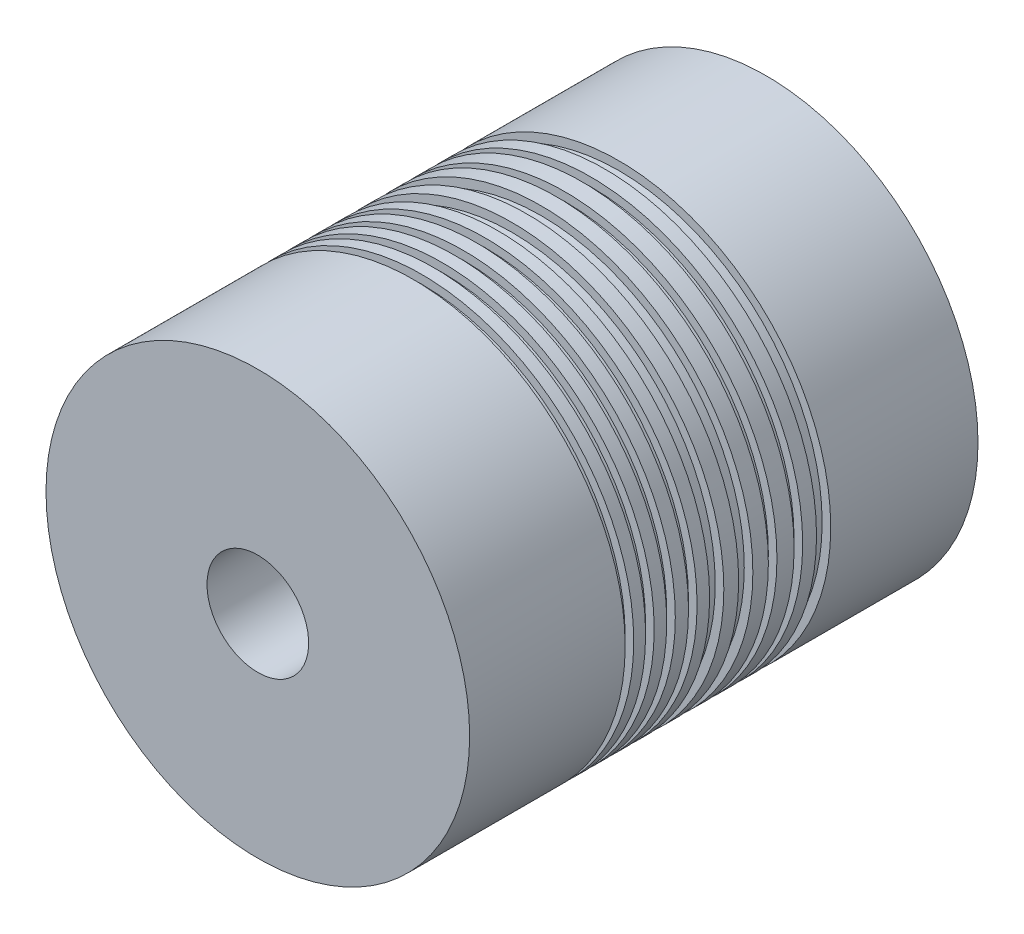
ISO-10303-21;
HEADER;
FILE_DESCRIPTION(('STEP AP214'),'2;1');
FILE_NAME('part.step','',(''),(''),'','','');
FILE_SCHEMA(('AUTOMOTIVE_DESIGN { 1 0 10303 214 1 1 1 1 }'));
ENDSEC;
DATA;
#1=APPLICATION_CONTEXT('core data for automotive mechanical design processes');
#2=APPLICATION_PROTOCOL_DEFINITION('international standard','automotive_design',2000,#1);
#3=PRODUCT_CONTEXT('',#1,'mechanical');
#4=PRODUCT('Part','Part','',(#3));
#5=PRODUCT_RELATED_PRODUCT_CATEGORY('part','',(#4));
#6=PRODUCT_DEFINITION_FORMATION('','',#4);
#7=PRODUCT_DEFINITION_CONTEXT('part definition',#1,'design');
#8=PRODUCT_DEFINITION('design','',#6,#7);
#9=PRODUCT_DEFINITION_SHAPE('','',#8);
#10=(LENGTH_UNIT() NAMED_UNIT(*) SI_UNIT(.MILLI.,.METRE.));
#11=(NAMED_UNIT(*) PLANE_ANGLE_UNIT() SI_UNIT($,.RADIAN.));
#12=(NAMED_UNIT(*) SI_UNIT($,.STERADIAN.) SOLID_ANGLE_UNIT());
#13=UNCERTAINTY_MEASURE_WITH_UNIT(LENGTH_MEASURE(1.E-05),#10,'distance_accuracy_value','');
#14=(GEOMETRIC_REPRESENTATION_CONTEXT(3) GLOBAL_UNCERTAINTY_ASSIGNED_CONTEXT((#13)) GLOBAL_UNIT_ASSIGNED_CONTEXT((#10,
#11,#12)) REPRESENTATION_CONTEXT('',''));
#15=CARTESIAN_POINT('',(0.,0.,0.));
#16=DIRECTION('',(0.,0.,1.));
#17=DIRECTION('',(1.,0.,0.));
#18=AXIS2_PLACEMENT_3D('',#15,#16,#17);
#19=CARTESIAN_POINT('',(0.,0.,0.));
#20=DIRECTION('',(0.,0.,1.));
#21=DIRECTION('',(1.,0.,0.));
#22=AXIS2_PLACEMENT_3D('',#19,#20,#21);
#23=CYLINDRICAL_SURFACE('',#22,12.5);
#24=CARTESIAN_POINT('',(0.,0.,14.12373645067));
#25=DIRECTION('',(0.,0.,1.));
#26=DIRECTION('',(1.,0.,0.));
#27=AXIS2_PLACEMENT_3D('',#24,#25,#26);
#28=CIRCLE('',#27,12.5);
#29=CARTESIAN_POINT('',(12.5,0.,14.12373645067));
#30=VERTEX_POINT('',#29);
#31=EDGE_CURVE('E142',#30,#30,#28,.F.);
#32=ORIENTED_EDGE('',*,*,#31,.F.);
#33=EDGE_LOOP('',(#32));
#34=FACE_BOUND('',#33,.T.);
#35=CARTESIAN_POINT('',(0.,0.,15.));
#36=DIRECTION('',(0.,0.,1.));
#37=DIRECTION('',(1.,0.,0.));
#38=AXIS2_PLACEMENT_3D('',#35,#36,#37);
#39=CIRCLE('',#38,12.5);
#40=CARTESIAN_POINT('',(12.5,0.,15.));
#41=VERTEX_POINT('',#40);
#42=EDGE_CURVE('E18',#41,#41,#39,.F.);
#43=ORIENTED_EDGE('',*,*,#42,.T.);
#44=EDGE_LOOP('',(#43));
#45=FACE_BOUND('',#44,.T.);
#46=ADVANCED_FACE('F15',(#34,#45),#23,.T.);
#47=CARTESIAN_POINT('',(0.,0.,15.));
#48=DIRECTION('',(0.,0.,-1.));
#49=DIRECTION('',(-1.,0.,0.));
#50=AXIS2_PLACEMENT_3D('',#47,#48,#49);
#51=PLANE('',#50);
#52=CARTESIAN_POINT('',(0.,0.,15.));
#53=DIRECTION('',(0.,0.,-1.));
#54=DIRECTION('',(-1.,0.,0.));
#55=AXIS2_PLACEMENT_3D('',#52,#53,#54);
#56=CIRCLE('',#55,11.99371439372);
#57=CARTESIAN_POINT('',(-11.99371439372,0.,15.));
#58=VERTEX_POINT('',#57);
#59=EDGE_CURVE('E140',#58,#58,#56,.F.);
#60=ORIENTED_EDGE('',*,*,#59,.F.);
#61=EDGE_LOOP('',(#60));
#62=FACE_BOUND('',#61,.T.);
#63=ORIENTED_EDGE('',*,*,#42,.F.);
#64=EDGE_LOOP('',(#63));
#65=FACE_BOUND('',#64,.T.);
#66=ADVANCED_FACE('F150',(#62,#65),#51,.F.);
#67=CARTESIAN_POINT('',(0.,0.,14.12373645067));
#68=DIRECTION('',(0.,0.,-1.));
#69=DIRECTION('',(-1.,0.,0.));
#70=AXIS2_PLACEMENT_3D('',#67,#68,#69);
#71=PLANE('',#70);
#72=CARTESIAN_POINT('',(0.,0.,14.12373645067));
#73=DIRECTION('',(0.,0.,-1.));
#74=DIRECTION('',(-1.,0.,0.));
#75=AXIS2_PLACEMENT_3D('',#72,#73,#74);
#76=CIRCLE('',#75,11.99371439372);
#77=CARTESIAN_POINT('',(-11.99371439372,0.,14.12373645067));
#78=VERTEX_POINT('',#77);
#79=EDGE_CURVE('E137',#78,#78,#76,.T.);
#80=ORIENTED_EDGE('',*,*,#79,.F.);
#81=EDGE_LOOP('',(#80));
#82=FACE_BOUND('',#81,.T.);
#83=ORIENTED_EDGE('',*,*,#31,.T.);
#84=EDGE_LOOP('',(#83));
#85=FACE_BOUND('',#84,.T.);
#86=ADVANCED_FACE('F152',(#82,#85),#71,.T.);
#87=CARTESIAN_POINT('',(0.,0.,21.42885357357));
#88=DIRECTION('',(0.,0.,-1.));
#89=DIRECTION('',(-1.,0.,0.));
#90=AXIS2_PLACEMENT_3D('',#87,#88,#89);
#91=CYLINDRICAL_SURFACE('',#90,11.99371439372);
#92=ORIENTED_EDGE('',*,*,#59,.T.);
#93=EDGE_LOOP('',(#92));
#94=FACE_BOUND('',#93,.T.);
#95=CARTESIAN_POINT('',(0.,0.,15.83731850269));
#96=DIRECTION('',(0.,0.,-1.));
#97=DIRECTION('',(-1.,0.,0.));
#98=AXIS2_PLACEMENT_3D('',#95,#96,#97);
#99=CIRCLE('',#98,11.99371439372);
#100=CARTESIAN_POINT('',(-11.99371439372,0.,15.83731850269));
#101=VERTEX_POINT('',#100);
#102=EDGE_CURVE('E134',#101,#101,#99,.F.);
#103=ORIENTED_EDGE('',*,*,#102,.F.);
#104=EDGE_LOOP('',(#103));
#105=FACE_BOUND('',#104,.T.);
#106=ADVANCED_FACE('F159',(#94,#105),#91,.T.);
#107=CARTESIAN_POINT('',(0.,0.,21.42885357357));
#108=DIRECTION('',(0.,0.,-1.));
#109=DIRECTION('',(-1.,0.,0.));
#110=AXIS2_PLACEMENT_3D('',#107,#108,#109);
#111=CYLINDRICAL_SURFACE('',#110,11.99371439372);
#112=CARTESIAN_POINT('',(0.,0.,13.28641794798));
#113=DIRECTION('',(0.,0.,-1.));
#114=DIRECTION('',(-1.,0.,0.));
#115=AXIS2_PLACEMENT_3D('',#112,#113,#114);
#116=CIRCLE('',#115,11.99371439372);
#117=CARTESIAN_POINT('',(-11.99371439372,0.,13.28641794798));
#118=VERTEX_POINT('',#117);
#119=EDGE_CURVE('E131',#118,#118,#116,.F.);
#120=ORIENTED_EDGE('',*,*,#119,.T.);
#121=EDGE_LOOP('',(#120));
#122=FACE_BOUND('',#121,.T.);
#123=ORIENTED_EDGE('',*,*,#79,.T.);
#124=EDGE_LOOP('',(#123));
#125=FACE_BOUND('',#124,.T.);
#126=ADVANCED_FACE('F314',(#122,#125),#111,.T.);
#127=CARTESIAN_POINT('',(0.,0.,15.83731850269));
#128=DIRECTION('',(0.,0.,-1.));
#129=DIRECTION('',(-1.,0.,0.));
#130=AXIS2_PLACEMENT_3D('',#127,#128,#129);
#131=PLANE('',#130);
#132=ORIENTED_EDGE('',*,*,#102,.T.);
#133=EDGE_LOOP('',(#132));
#134=FACE_BOUND('',#133,.T.);
#135=CARTESIAN_POINT('',(0.,0.,15.83731850269));
#136=DIRECTION('',(0.,0.,1.));
#137=DIRECTION('',(1.,0.,0.));
#138=AXIS2_PLACEMENT_3D('',#135,#136,#137);
#139=CIRCLE('',#138,12.5);
#140=CARTESIAN_POINT('',(12.5,0.,15.83731850269));
#141=VERTEX_POINT('',#140);
#142=EDGE_CURVE('E128',#141,#141,#139,.T.);
#143=ORIENTED_EDGE('',*,*,#142,.F.);
#144=EDGE_LOOP('',(#143));
#145=FACE_BOUND('',#144,.T.);
#146=ADVANCED_FACE('F310',(#134,#145),#131,.T.);
#147=CARTESIAN_POINT('',(0.,0.,13.28641794798));
#148=DIRECTION('',(0.,0.,-1.));
#149=DIRECTION('',(-1.,0.,0.));
#150=AXIS2_PLACEMENT_3D('',#147,#148,#149);
#151=PLANE('',#150);
#152=ORIENTED_EDGE('',*,*,#119,.F.);
#153=EDGE_LOOP('',(#152));
#154=FACE_BOUND('',#153,.T.);
#155=CARTESIAN_POINT('',(0.,0.,13.28641794798));
#156=DIRECTION('',(0.,0.,1.));
#157=DIRECTION('',(1.,0.,0.));
#158=AXIS2_PLACEMENT_3D('',#155,#156,#157);
#159=CIRCLE('',#158,12.5);
#160=CARTESIAN_POINT('',(12.5,0.,13.28641794798));
#161=VERTEX_POINT('',#160);
#162=EDGE_CURVE('E125',#161,#161,#159,.F.);
#163=ORIENTED_EDGE('',*,*,#162,.F.);
#164=EDGE_LOOP('',(#163));
#165=FACE_BOUND('',#164,.T.);
#166=ADVANCED_FACE('F306',(#154,#165),#151,.F.);
#167=CARTESIAN_POINT('',(0.,0.,0.));
#168=DIRECTION('',(0.,0.,1.));
#169=DIRECTION('',(1.,0.,0.));
#170=AXIS2_PLACEMENT_3D('',#167,#168,#169);
#171=CYLINDRICAL_SURFACE('',#170,12.5);
#172=ORIENTED_EDGE('',*,*,#142,.T.);
#173=EDGE_LOOP('',(#172));
#174=FACE_BOUND('',#173,.T.);
#175=CARTESIAN_POINT('',(0.,0.,16.57727438879));
#176=DIRECTION('',(0.,0.,1.));
#177=DIRECTION('',(1.,0.,0.));
#178=AXIS2_PLACEMENT_3D('',#175,#176,#177);
#179=CIRCLE('',#178,12.5);
#180=CARTESIAN_POINT('',(12.5,0.,16.57727438879));
#181=VERTEX_POINT('',#180);
#182=EDGE_CURVE('E122',#181,#181,#179,.F.);
#183=ORIENTED_EDGE('',*,*,#182,.T.);
#184=EDGE_LOOP('',(#183));
#185=FACE_BOUND('',#184,.T.);
#186=ADVANCED_FACE('F302',(#174,#185),#171,.T.);
#187=CARTESIAN_POINT('',(0.,0.,0.));
#188=DIRECTION('',(0.,0.,1.));
#189=DIRECTION('',(1.,0.,0.));
#190=AXIS2_PLACEMENT_3D('',#187,#188,#189);
#191=CYLINDRICAL_SURFACE('',#190,12.5);
#192=CARTESIAN_POINT('',(0.,0.,12.37120935202));
#193=DIRECTION('',(0.,0.,1.));
#194=DIRECTION('',(1.,0.,0.));
#195=AXIS2_PLACEMENT_3D('',#192,#193,#194);
#196=CIRCLE('',#195,12.5);
#197=CARTESIAN_POINT('',(12.5,0.,12.37120935202));
#198=VERTEX_POINT('',#197);
#199=EDGE_CURVE('E119',#198,#198,#196,.F.);
#200=ORIENTED_EDGE('',*,*,#199,.F.);
#201=EDGE_LOOP('',(#200));
#202=FACE_BOUND('',#201,.T.);
#203=ORIENTED_EDGE('',*,*,#162,.T.);
#204=EDGE_LOOP('',(#203));
#205=FACE_BOUND('',#204,.T.);
#206=ADVANCED_FACE('F298',(#202,#205),#191,.T.);
#207=CARTESIAN_POINT('',(0.,0.,16.57727438879));
#208=DIRECTION('',(0.,0.,-1.));
#209=DIRECTION('',(-1.,0.,0.));
#210=AXIS2_PLACEMENT_3D('',#207,#208,#209);
#211=PLANE('',#210);
#212=CARTESIAN_POINT('',(0.,0.,16.57727438879));
#213=DIRECTION('',(0.,0.,-1.));
#214=DIRECTION('',(-1.,0.,0.));
#215=AXIS2_PLACEMENT_3D('',#212,#213,#214);
#216=CIRCLE('',#215,11.99371439372);
#217=CARTESIAN_POINT('',(-11.99371439372,0.,16.57727438879));
#218=VERTEX_POINT('',#217);
#219=EDGE_CURVE('E116',#218,#218,#216,.F.);
#220=ORIENTED_EDGE('',*,*,#219,.F.);
#221=EDGE_LOOP('',(#220));
#222=FACE_BOUND('',#221,.T.);
#223=ORIENTED_EDGE('',*,*,#182,.F.);
#224=EDGE_LOOP('',(#223));
#225=FACE_BOUND('',#224,.T.);
#226=ADVANCED_FACE('F294',(#222,#225),#211,.F.);
#227=CARTESIAN_POINT('',(0.,0.,12.37120935202));
#228=DIRECTION('',(0.,0.,-1.));
#229=DIRECTION('',(-1.,0.,0.));
#230=AXIS2_PLACEMENT_3D('',#227,#228,#229);
#231=PLANE('',#230);
#232=CARTESIAN_POINT('',(0.,0.,12.37120935202));
#233=DIRECTION('',(0.,0.,-1.));
#234=DIRECTION('',(-1.,0.,0.));
#235=AXIS2_PLACEMENT_3D('',#232,#233,#234);
#236=CIRCLE('',#235,11.99371439372);
#237=CARTESIAN_POINT('',(-11.99371439372,0.,12.37120935202));
#238=VERTEX_POINT('',#237);
#239=EDGE_CURVE('E113',#238,#238,#236,.T.);
#240=ORIENTED_EDGE('',*,*,#239,.F.);
#241=EDGE_LOOP('',(#240));
#242=FACE_BOUND('',#241,.T.);
#243=ORIENTED_EDGE('',*,*,#199,.T.);
#244=EDGE_LOOP('',(#243));
#245=FACE_BOUND('',#244,.T.);
#246=ADVANCED_FACE('F290',(#242,#245),#231,.T.);
#247=CARTESIAN_POINT('',(0.,0.,21.42885357357));
#248=DIRECTION('',(0.,0.,-1.));
#249=DIRECTION('',(-1.,0.,0.));
#250=AXIS2_PLACEMENT_3D('',#247,#248,#249);
#251=CYLINDRICAL_SURFACE('',#250,11.99371439372);
#252=ORIENTED_EDGE('',*,*,#219,.T.);
#253=EDGE_LOOP('',(#252));
#254=FACE_BOUND('',#253,.T.);
#255=CARTESIAN_POINT('',(0.,0.,17.08355999507));
#256=DIRECTION('',(0.,0.,-1.));
#257=DIRECTION('',(-1.,0.,0.));
#258=AXIS2_PLACEMENT_3D('',#255,#256,#257);
#259=CIRCLE('',#258,11.99371439372);
#260=CARTESIAN_POINT('',(-11.99371439372,0.,17.08355999507));
#261=VERTEX_POINT('',#260);
#262=EDGE_CURVE('E110',#261,#261,#259,.F.);
#263=ORIENTED_EDGE('',*,*,#262,.F.);
#264=EDGE_LOOP('',(#263));
#265=FACE_BOUND('',#264,.T.);
#266=ADVANCED_FACE('F286',(#254,#265),#251,.T.);
#267=CARTESIAN_POINT('',(0.,0.,21.42885357357));
#268=DIRECTION('',(0.,0.,-1.));
#269=DIRECTION('',(-1.,0.,0.));
#270=AXIS2_PLACEMENT_3D('',#267,#268,#269);
#271=CYLINDRICAL_SURFACE('',#270,11.99371439372);
#272=CARTESIAN_POINT('',(0.,0.,11.86492374574));
#273=DIRECTION('',(0.,0.,-1.));
#274=DIRECTION('',(-1.,0.,0.));
#275=AXIS2_PLACEMENT_3D('',#272,#273,#274);
#276=CIRCLE('',#275,11.99371439372);
#277=CARTESIAN_POINT('',(-11.99371439372,0.,11.86492374574));
#278=VERTEX_POINT('',#277);
#279=EDGE_CURVE('E107',#278,#278,#276,.F.);
#280=ORIENTED_EDGE('',*,*,#279,.T.);
#281=EDGE_LOOP('',(#280));
#282=FACE_BOUND('',#281,.T.);
#283=ORIENTED_EDGE('',*,*,#239,.T.);
#284=EDGE_LOOP('',(#283));
#285=FACE_BOUND('',#284,.T.);
#286=ADVANCED_FACE('F282',(#282,#285),#271,.T.);
#287=CARTESIAN_POINT('',(0.,0.,17.08355999507));
#288=DIRECTION('',(0.,0.,-1.));
#289=DIRECTION('',(-1.,0.,0.));
#290=AXIS2_PLACEMENT_3D('',#287,#288,#289);
#291=PLANE('',#290);
#292=ORIENTED_EDGE('',*,*,#262,.T.);
#293=EDGE_LOOP('',(#292));
#294=FACE_BOUND('',#293,.T.);
#295=CARTESIAN_POINT('',(0.,0.,17.08355999507));
#296=DIRECTION('',(0.,0.,1.));
#297=DIRECTION('',(1.,0.,0.));
#298=AXIS2_PLACEMENT_3D('',#295,#296,#297);
#299=CIRCLE('',#298,12.5);
#300=CARTESIAN_POINT('',(12.5,0.,17.08355999507));
#301=VERTEX_POINT('',#300);
#302=EDGE_CURVE('E104',#301,#301,#299,.T.);
#303=ORIENTED_EDGE('',*,*,#302,.F.);
#304=EDGE_LOOP('',(#303));
#305=FACE_BOUND('',#304,.T.);
#306=ADVANCED_FACE('F278',(#294,#305),#291,.T.);
#307=CARTESIAN_POINT('',(0.,0.,11.86492374574));
#308=DIRECTION('',(0.,0.,-1.));
#309=DIRECTION('',(-1.,0.,0.));
#310=AXIS2_PLACEMENT_3D('',#307,#308,#309);
#311=PLANE('',#310);
#312=ORIENTED_EDGE('',*,*,#279,.F.);
#313=EDGE_LOOP('',(#312));
#314=FACE_BOUND('',#313,.T.);
#315=CARTESIAN_POINT('',(0.,0.,11.86492374574));
#316=DIRECTION('',(0.,0.,1.));
#317=DIRECTION('',(1.,0.,0.));
#318=AXIS2_PLACEMENT_3D('',#315,#316,#317);
#319=CIRCLE('',#318,12.5);
#320=CARTESIAN_POINT('',(12.5,0.,11.86492374574));
#321=VERTEX_POINT('',#320);
#322=EDGE_CURVE('E101',#321,#321,#319,.F.);
#323=ORIENTED_EDGE('',*,*,#322,.F.);
#324=EDGE_LOOP('',(#323));
#325=FACE_BOUND('',#324,.T.);
#326=ADVANCED_FACE('F274',(#314,#325),#311,.F.);
#327=CARTESIAN_POINT('',(0.,0.,0.));
#328=DIRECTION('',(0.,0.,1.));
#329=DIRECTION('',(1.,0.,0.));
#330=AXIS2_PLACEMENT_3D('',#327,#328,#329);
#331=CYLINDRICAL_SURFACE('',#330,12.5);
#332=ORIENTED_EDGE('',*,*,#302,.T.);
#333=EDGE_LOOP('',(#332));
#334=FACE_BOUND('',#333,.T.);
#335=CARTESIAN_POINT('',(0.,0.,17.8624609278));
#336=DIRECTION('',(0.,0.,1.));
#337=DIRECTION('',(1.,0.,0.));
#338=AXIS2_PLACEMENT_3D('',#335,#336,#337);
#339=CIRCLE('',#338,12.5);
#340=CARTESIAN_POINT('',(12.5,0.,17.8624609278));
#341=VERTEX_POINT('',#340);
#342=EDGE_CURVE('E98',#341,#341,#339,.F.);
#343=ORIENTED_EDGE('',*,*,#342,.T.);
#344=EDGE_LOOP('',(#343));
#345=FACE_BOUND('',#344,.T.);
#346=ADVANCED_FACE('F270',(#334,#345),#331,.T.);
#347=CARTESIAN_POINT('',(0.,0.,0.));
#348=DIRECTION('',(0.,0.,1.));
#349=DIRECTION('',(1.,0.,0.));
#350=AXIS2_PLACEMENT_3D('',#347,#348,#349);
#351=CYLINDRICAL_SURFACE('',#350,12.5);
#352=CARTESIAN_POINT('',(0.,0.,10.85235253318));
#353=DIRECTION('',(0.,0.,1.));
#354=DIRECTION('',(1.,0.,0.));
#355=AXIS2_PLACEMENT_3D('',#352,#353,#354);
#356=CIRCLE('',#355,12.5);
#357=CARTESIAN_POINT('',(12.5,0.,10.85235253318));
#358=VERTEX_POINT('',#357);
#359=EDGE_CURVE('E95',#358,#358,#356,.F.);
#360=ORIENTED_EDGE('',*,*,#359,.F.);
#361=EDGE_LOOP('',(#360));
#362=FACE_BOUND('',#361,.T.);
#363=ORIENTED_EDGE('',*,*,#322,.T.);
#364=EDGE_LOOP('',(#363));
#365=FACE_BOUND('',#364,.T.);
#366=ADVANCED_FACE('F266',(#362,#365),#351,.T.);
#367=CARTESIAN_POINT('',(0.,0.,17.8624609278));
#368=DIRECTION('',(0.,0.,-1.));
#369=DIRECTION('',(-1.,0.,0.));
#370=AXIS2_PLACEMENT_3D('',#367,#368,#369);
#371=PLANE('',#370);
#372=CARTESIAN_POINT('',(0.,0.,17.8624609278));
#373=DIRECTION('',(0.,0.,-1.));
#374=DIRECTION('',(-1.,0.,0.));
#375=AXIS2_PLACEMENT_3D('',#372,#373,#374);
#376=CIRCLE('',#375,11.99371439372);
#377=CARTESIAN_POINT('',(-11.99371439372,0.,17.8624609278));
#378=VERTEX_POINT('',#377);
#379=EDGE_CURVE('E92',#378,#378,#376,.F.);
#380=ORIENTED_EDGE('',*,*,#379,.F.);
#381=EDGE_LOOP('',(#380));
#382=FACE_BOUND('',#381,.T.);
#383=ORIENTED_EDGE('',*,*,#342,.F.);
#384=EDGE_LOOP('',(#383));
#385=FACE_BOUND('',#384,.T.);
#386=ADVANCED_FACE('F262',(#382,#385),#371,.F.);
#387=CARTESIAN_POINT('',(0.,0.,10.85235253318));
#388=DIRECTION('',(0.,0.,-1.));
#389=DIRECTION('',(-1.,0.,0.));
#390=AXIS2_PLACEMENT_3D('',#387,#388,#389);
#391=PLANE('',#390);
#392=CARTESIAN_POINT('',(0.,0.,10.85235253318));
#393=DIRECTION('',(0.,0.,-1.));
#394=DIRECTION('',(-1.,0.,0.));
#395=AXIS2_PLACEMENT_3D('',#392,#393,#394);
#396=CIRCLE('',#395,11.99371439372);
#397=CARTESIAN_POINT('',(-11.99371439372,0.,10.85235253318));
#398=VERTEX_POINT('',#397);
#399=EDGE_CURVE('E89',#398,#398,#396,.T.);
#400=ORIENTED_EDGE('',*,*,#399,.F.);
#401=EDGE_LOOP('',(#400));
#402=FACE_BOUND('',#401,.T.);
#403=ORIENTED_EDGE('',*,*,#359,.T.);
#404=EDGE_LOOP('',(#403));
#405=FACE_BOUND('',#404,.T.);
#406=ADVANCED_FACE('F258',(#402,#405),#391,.T.);
#407=CARTESIAN_POINT('',(0.,0.,21.42885357357));
#408=DIRECTION('',(0.,0.,-1.));
#409=DIRECTION('',(-1.,0.,0.));
#410=AXIS2_PLACEMENT_3D('',#407,#408,#409);
#411=CYLINDRICAL_SURFACE('',#410,11.99371439372);
#412=ORIENTED_EDGE('',*,*,#379,.T.);
#413=EDGE_LOOP('',(#412));
#414=FACE_BOUND('',#413,.T.);
#415=CARTESIAN_POINT('',(0.,0.,18.36874653408));
#416=DIRECTION('',(0.,0.,-1.));
#417=DIRECTION('',(-1.,0.,0.));
#418=AXIS2_PLACEMENT_3D('',#415,#416,#417);
#419=CIRCLE('',#418,11.99371439372);
#420=CARTESIAN_POINT('',(-11.99371439372,0.,18.36874653408));
#421=VERTEX_POINT('',#420);
#422=EDGE_CURVE('E86',#421,#421,#419,.F.);
#423=ORIENTED_EDGE('',*,*,#422,.F.);
#424=EDGE_LOOP('',(#423));
#425=FACE_BOUND('',#424,.T.);
#426=ADVANCED_FACE('F254',(#414,#425),#411,.T.);
#427=CARTESIAN_POINT('',(0.,0.,21.42885357357));
#428=DIRECTION('',(0.,0.,-1.));
#429=DIRECTION('',(-1.,0.,0.));
#430=AXIS2_PLACEMENT_3D('',#427,#428,#429);
#431=CYLINDRICAL_SURFACE('',#430,11.99371439372);
#432=CARTESIAN_POINT('',(0.,0.,10.3460669269));
#433=DIRECTION('',(0.,0.,-1.));
#434=DIRECTION('',(-1.,0.,0.));
#435=AXIS2_PLACEMENT_3D('',#432,#433,#434);
#436=CIRCLE('',#435,11.99371439372);
#437=CARTESIAN_POINT('',(-11.99371439372,0.,10.3460669269));
#438=VERTEX_POINT('',#437);
#439=EDGE_CURVE('E83',#438,#438,#436,.F.);
#440=ORIENTED_EDGE('',*,*,#439,.T.);
#441=EDGE_LOOP('',(#440));
#442=FACE_BOUND('',#441,.T.);
#443=ORIENTED_EDGE('',*,*,#399,.T.);
#444=EDGE_LOOP('',(#443));
#445=FACE_BOUND('',#444,.T.);
#446=ADVANCED_FACE('F250',(#442,#445),#431,.T.);
#447=CARTESIAN_POINT('',(0.,0.,18.36874653408));
#448=DIRECTION('',(0.,0.,-1.));
#449=DIRECTION('',(-1.,0.,0.));
#450=AXIS2_PLACEMENT_3D('',#447,#448,#449);
#451=PLANE('',#450);
#452=ORIENTED_EDGE('',*,*,#422,.T.);
#453=EDGE_LOOP('',(#452));
#454=FACE_BOUND('',#453,.T.);
#455=CARTESIAN_POINT('',(0.,0.,18.36874653408));
#456=DIRECTION('',(0.,0.,1.));
#457=DIRECTION('',(1.,0.,0.));
#458=AXIS2_PLACEMENT_3D('',#455,#456,#457);
#459=CIRCLE('',#458,12.5);
#460=CARTESIAN_POINT('',(12.5,0.,18.36874653408));
#461=VERTEX_POINT('',#460);
#462=EDGE_CURVE('E80',#461,#461,#459,.T.);
#463=ORIENTED_EDGE('',*,*,#462,.F.);
#464=EDGE_LOOP('',(#463));
#465=FACE_BOUND('',#464,.T.);
#466=ADVANCED_FACE('F246',(#454,#465),#451,.T.);
#467=CARTESIAN_POINT('',(0.,0.,10.3460669269));
#468=DIRECTION('',(0.,0.,-1.));
#469=DIRECTION('',(-1.,0.,0.));
#470=AXIS2_PLACEMENT_3D('',#467,#468,#469);
#471=PLANE('',#470);
#472=ORIENTED_EDGE('',*,*,#439,.F.);
#473=EDGE_LOOP('',(#472));
#474=FACE_BOUND('',#473,.T.);
#475=CARTESIAN_POINT('',(0.,0.,10.3460669269));
#476=DIRECTION('',(0.,0.,1.));
#477=DIRECTION('',(1.,0.,0.));
#478=AXIS2_PLACEMENT_3D('',#475,#476,#477);
#479=CIRCLE('',#478,12.5);
#480=CARTESIAN_POINT('',(12.5,0.,10.3460669269));
#481=VERTEX_POINT('',#480);
#482=EDGE_CURVE('E77',#481,#481,#479,.F.);
#483=ORIENTED_EDGE('',*,*,#482,.F.);
#484=EDGE_LOOP('',(#483));
#485=FACE_BOUND('',#484,.T.);
#486=ADVANCED_FACE('F242',(#474,#485),#471,.F.);
#487=CARTESIAN_POINT('',(0.,0.,0.));
#488=DIRECTION('',(0.,0.,1.));
#489=DIRECTION('',(1.,0.,0.));
#490=AXIS2_PLACEMENT_3D('',#487,#488,#489);
#491=CYLINDRICAL_SURFACE('',#490,12.5);
#492=CARTESIAN_POINT('',(0.,0.,19.10870242018));
#493=DIRECTION('',(0.,0.,1.));
#494=DIRECTION('',(1.,0.,0.));
#495=AXIS2_PLACEMENT_3D('',#492,#493,#494);
#496=CIRCLE('',#495,12.5);
#497=CARTESIAN_POINT('',(12.5,0.,19.10870242018));
#498=VERTEX_POINT('',#497);
#499=EDGE_CURVE('E74',#498,#498,#496,.F.);
#500=ORIENTED_EDGE('',*,*,#499,.T.);
#501=EDGE_LOOP('',(#500));
#502=FACE_BOUND('',#501,.T.);
#503=ORIENTED_EDGE('',*,*,#462,.T.);
#504=EDGE_LOOP('',(#503));
#505=FACE_BOUND('',#504,.T.);
#506=ADVANCED_FACE('F238',(#502,#505),#491,.T.);
#507=CARTESIAN_POINT('',(0.,0.,0.));
#508=DIRECTION('',(0.,0.,1.));
#509=DIRECTION('',(1.,0.,0.));
#510=AXIS2_PLACEMENT_3D('',#507,#508,#509);
#511=CYLINDRICAL_SURFACE('',#510,12.5);
#512=CARTESIAN_POINT('',(0.,0.,9.528220947532));
#513=DIRECTION('',(0.,0.,1.));
#514=DIRECTION('',(1.,0.,0.));
#515=AXIS2_PLACEMENT_3D('',#512,#513,#514);
#516=CIRCLE('',#515,12.5);
#517=CARTESIAN_POINT('',(12.5,0.,9.528220947532));
#518=VERTEX_POINT('',#517);
#519=EDGE_CURVE('E71',#518,#518,#516,.F.);
#520=ORIENTED_EDGE('',*,*,#519,.F.);
#521=EDGE_LOOP('',(#520));
#522=FACE_BOUND('',#521,.T.);
#523=ORIENTED_EDGE('',*,*,#482,.T.);
#524=EDGE_LOOP('',(#523));
#525=FACE_BOUND('',#524,.T.);
#526=ADVANCED_FACE('F234',(#522,#525),#511,.T.);
#527=CARTESIAN_POINT('',(0.,0.,19.10870242018));
#528=DIRECTION('',(0.,0.,-1.));
#529=DIRECTION('',(-1.,0.,0.));
#530=AXIS2_PLACEMENT_3D('',#527,#528,#529);
#531=PLANE('',#530);
#532=CARTESIAN_POINT('',(0.,0.,19.10870242018));
#533=DIRECTION('',(0.,0.,-1.));
#534=DIRECTION('',(-1.,0.,0.));
#535=AXIS2_PLACEMENT_3D('',#532,#533,#534);
#536=CIRCLE('',#535,11.99371439372);
#537=CARTESIAN_POINT('',(-11.99371439372,0.,19.10870242018));
#538=VERTEX_POINT('',#537);
#539=EDGE_CURVE('E68',#538,#538,#536,.F.);
#540=ORIENTED_EDGE('',*,*,#539,.F.);
#541=EDGE_LOOP('',(#540));
#542=FACE_BOUND('',#541,.T.);
#543=ORIENTED_EDGE('',*,*,#499,.F.);
#544=EDGE_LOOP('',(#543));
#545=FACE_BOUND('',#544,.T.);
#546=ADVANCED_FACE('F230',(#542,#545),#531,.F.);
#547=CARTESIAN_POINT('',(0.,0.,9.528220947532));
#548=DIRECTION('',(0.,0.,-1.));
#549=DIRECTION('',(-1.,0.,0.));
#550=AXIS2_PLACEMENT_3D('',#547,#548,#549);
#551=PLANE('',#550);
#552=CARTESIAN_POINT('',(0.,0.,9.528220947532));
#553=DIRECTION('',(0.,0.,-1.));
#554=DIRECTION('',(-1.,0.,0.));
#555=AXIS2_PLACEMENT_3D('',#552,#553,#554);
#556=CIRCLE('',#555,11.99371439372);
#557=CARTESIAN_POINT('',(-11.99371439372,0.,9.528220947532));
#558=VERTEX_POINT('',#557);
#559=EDGE_CURVE('E65',#558,#558,#556,.T.);
#560=ORIENTED_EDGE('',*,*,#559,.F.);
#561=EDGE_LOOP('',(#560));
#562=FACE_BOUND('',#561,.T.);
#563=ORIENTED_EDGE('',*,*,#519,.T.);
#564=EDGE_LOOP('',(#563));
#565=FACE_BOUND('',#564,.T.);
#566=ADVANCED_FACE('F226',(#562,#565),#551,.T.);
#567=CARTESIAN_POINT('',(0.,0.,21.42885357357));
#568=DIRECTION('',(0.,0.,-1.));
#569=DIRECTION('',(-1.,0.,0.));
#570=AXIS2_PLACEMENT_3D('',#567,#568,#569);
#571=CYLINDRICAL_SURFACE('',#570,11.99371439372);
#572=ORIENTED_EDGE('',*,*,#539,.T.);
#573=EDGE_LOOP('',(#572));
#574=FACE_BOUND('',#573,.T.);
#575=CARTESIAN_POINT('',(0.,0.,19.61498802646));
#576=DIRECTION('',(0.,0.,-1.));
#577=DIRECTION('',(-1.,0.,0.));
#578=AXIS2_PLACEMENT_3D('',#575,#576,#577);
#579=CIRCLE('',#578,11.99371439372);
#580=CARTESIAN_POINT('',(-11.99371439372,0.,19.61498802646));
#581=VERTEX_POINT('',#580);
#582=EDGE_CURVE('E62',#581,#581,#579,.F.);
#583=ORIENTED_EDGE('',*,*,#582,.F.);
#584=EDGE_LOOP('',(#583));
#585=FACE_BOUND('',#584,.T.);
#586=ADVANCED_FACE('F222',(#574,#585),#571,.T.);
#587=CARTESIAN_POINT('',(0.,0.,21.42885357357));
#588=DIRECTION('',(0.,0.,-1.));
#589=DIRECTION('',(-1.,0.,0.));
#590=AXIS2_PLACEMENT_3D('',#587,#588,#589);
#591=CYLINDRICAL_SURFACE('',#590,11.99371439372);
#592=CARTESIAN_POINT('',(0.,0.,8.690902444841));
#593=DIRECTION('',(0.,0.,-1.));
#594=DIRECTION('',(-1.,0.,0.));
#595=AXIS2_PLACEMENT_3D('',#592,#593,#594);
#596=CIRCLE('',#595,11.99371439372);
#597=CARTESIAN_POINT('',(-11.99371439372,0.,8.690902444841));
#598=VERTEX_POINT('',#597);
#599=EDGE_CURVE('E59',#598,#598,#596,.F.);
#600=ORIENTED_EDGE('',*,*,#599,.T.);
#601=EDGE_LOOP('',(#600));
#602=FACE_BOUND('',#601,.T.);
#603=ORIENTED_EDGE('',*,*,#559,.T.);
#604=EDGE_LOOP('',(#603));
#605=FACE_BOUND('',#604,.T.);
#606=ADVANCED_FACE('F218',(#602,#605),#591,.T.);
#607=CARTESIAN_POINT('',(0.,0.,19.61498802646));
#608=DIRECTION('',(0.,0.,-1.));
#609=DIRECTION('',(-1.,0.,0.));
#610=AXIS2_PLACEMENT_3D('',#607,#608,#609);
#611=PLANE('',#610);
#612=ORIENTED_EDGE('',*,*,#582,.T.);
#613=EDGE_LOOP('',(#612));
#614=FACE_BOUND('',#613,.T.);
#615=CARTESIAN_POINT('',(0.,0.,19.61498802646));
#616=DIRECTION('',(0.,0.,1.));
#617=DIRECTION('',(1.,0.,0.));
#618=AXIS2_PLACEMENT_3D('',#615,#616,#617);
#619=CIRCLE('',#618,12.5);
#620=CARTESIAN_POINT('',(12.5,0.,19.61498802646));
#621=VERTEX_POINT('',#620);
#622=EDGE_CURVE('E56',#621,#621,#619,.T.);
#623=ORIENTED_EDGE('',*,*,#622,.F.);
#624=EDGE_LOOP('',(#623));
#625=FACE_BOUND('',#624,.T.);
#626=ADVANCED_FACE('F214',(#614,#625),#611,.T.);
#627=CARTESIAN_POINT('',(0.,0.,8.690902444841));
#628=DIRECTION('',(0.,0.,-1.));
#629=DIRECTION('',(-1.,0.,0.));
#630=AXIS2_PLACEMENT_3D('',#627,#628,#629);
#631=PLANE('',#630);
#632=ORIENTED_EDGE('',*,*,#599,.F.);
#633=EDGE_LOOP('',(#632));
#634=FACE_BOUND('',#633,.T.);
#635=CARTESIAN_POINT('',(0.,0.,8.690902444841));
#636=DIRECTION('',(0.,0.,1.));
#637=DIRECTION('',(1.,0.,0.));
#638=AXIS2_PLACEMENT_3D('',#635,#636,#637);
#639=CIRCLE('',#638,12.5);
#640=CARTESIAN_POINT('',(12.5,0.,8.690902444841));
#641=VERTEX_POINT('',#640);
#642=EDGE_CURVE('E53',#641,#641,#639,.F.);
#643=ORIENTED_EDGE('',*,*,#642,.F.);
#644=EDGE_LOOP('',(#643));
#645=FACE_BOUND('',#644,.T.);
#646=ADVANCED_FACE('F210',(#634,#645),#631,.F.);
#647=CARTESIAN_POINT('',(0.,0.,0.));
#648=DIRECTION('',(0.,0.,1.));
#649=DIRECTION('',(1.,0.,0.));
#650=AXIS2_PLACEMENT_3D('',#647,#648,#649);
#651=CYLINDRICAL_SURFACE('',#650,12.5);
#652=CARTESIAN_POINT('',(0.,0.,20.31599886592));
#653=DIRECTION('',(0.,0.,1.));
#654=DIRECTION('',(1.,0.,0.));
#655=AXIS2_PLACEMENT_3D('',#652,#653,#654);
#656=CIRCLE('',#655,12.5);
#657=CARTESIAN_POINT('',(12.5,0.,20.31599886592));
#658=VERTEX_POINT('',#657);
#659=EDGE_CURVE('E50',#658,#658,#656,.F.);
#660=ORIENTED_EDGE('',*,*,#659,.T.);
#661=EDGE_LOOP('',(#660));
#662=FACE_BOUND('',#661,.T.);
#663=ORIENTED_EDGE('',*,*,#622,.T.);
#664=EDGE_LOOP('',(#663));
#665=FACE_BOUND('',#664,.T.);
#666=ADVANCED_FACE('F206',(#662,#665),#651,.T.);
#667=CARTESIAN_POINT('',(0.,0.,0.));
#668=DIRECTION('',(0.,0.,1.));
#669=DIRECTION('',(1.,0.,0.));
#670=AXIS2_PLACEMENT_3D('',#667,#668,#669);
#671=CYLINDRICAL_SURFACE('',#670,12.5);
#672=CARTESIAN_POINT('',(0.,0.,0.));
#673=DIRECTION('',(0.,0.,1.));
#674=DIRECTION('',(1.,0.,0.));
#675=AXIS2_PLACEMENT_3D('',#672,#673,#674);
#676=CIRCLE('',#675,12.5);
#677=CARTESIAN_POINT('',(12.5,0.,0.));
#678=VERTEX_POINT('',#677);
#679=EDGE_CURVE('E47',#678,#678,#676,.T.);
#680=ORIENTED_EDGE('',*,*,#679,.T.);
#681=EDGE_LOOP('',(#680));
#682=FACE_BOUND('',#681,.T.);
#683=ORIENTED_EDGE('',*,*,#642,.T.);
#684=EDGE_LOOP('',(#683));
#685=FACE_BOUND('',#684,.T.);
#686=ADVANCED_FACE('F202',(#682,#685),#671,.T.);
#687=CARTESIAN_POINT('',(0.,0.,20.31599886592));
#688=DIRECTION('',(0.,0.,-1.));
#689=DIRECTION('',(-1.,0.,0.));
#690=AXIS2_PLACEMENT_3D('',#687,#688,#689);
#691=PLANE('',#690);
#692=CARTESIAN_POINT('',(0.,0.,20.31599886592));
#693=DIRECTION('',(0.,0.,-1.));
#694=DIRECTION('',(-1.,0.,0.));
#695=AXIS2_PLACEMENT_3D('',#692,#693,#694);
#696=CIRCLE('',#695,11.99371439372);
#697=CARTESIAN_POINT('',(-11.99371439372,0.,20.31599886592));
#698=VERTEX_POINT('',#697);
#699=EDGE_CURVE('E44',#698,#698,#696,.F.);
#700=ORIENTED_EDGE('',*,*,#699,.F.);
#701=EDGE_LOOP('',(#700));
#702=FACE_BOUND('',#701,.T.);
#703=ORIENTED_EDGE('',*,*,#659,.F.);
#704=EDGE_LOOP('',(#703));
#705=FACE_BOUND('',#704,.T.);
#706=ADVANCED_FACE('F198',(#702,#705),#691,.F.);
#707=CARTESIAN_POINT('',(0.,0.,0.));
#708=DIRECTION('',(0.,0.,1.));
#709=DIRECTION('',(1.,0.,0.));
#710=AXIS2_PLACEMENT_3D('',#707,#708,#709);
#711=PLANE('',#710);
#712=CARTESIAN_POINT('',(0.,0.,0.));
#713=DIRECTION('',(0.,0.,1.));
#714=DIRECTION('',(1.,0.,0.));
#715=AXIS2_PLACEMENT_3D('',#712,#713,#714);
#716=CIRCLE('',#715,5.);
#717=CARTESIAN_POINT('',(5.,0.,0.));
#718=VERTEX_POINT('',#717);
#719=EDGE_CURVE('E41',#718,#718,#716,.T.);
#720=ORIENTED_EDGE('',*,*,#719,.T.);
#721=EDGE_LOOP('',(#720));
#722=FACE_BOUND('',#721,.T.);
#723=ORIENTED_EDGE('',*,*,#679,.F.);
#724=EDGE_LOOP('',(#723));
#725=FACE_BOUND('',#724,.T.);
#726=ADVANCED_FACE('F194',(#722,#725),#711,.F.);
#727=CARTESIAN_POINT('',(0.,0.,21.42885357357));
#728=DIRECTION('',(0.,0.,-1.));
#729=DIRECTION('',(-1.,0.,0.));
#730=AXIS2_PLACEMENT_3D('',#727,#728,#729);
#731=CYLINDRICAL_SURFACE('',#730,11.99371439372);
#732=ORIENTED_EDGE('',*,*,#699,.T.);
#733=EDGE_LOOP('',(#732));
#734=FACE_BOUND('',#733,.T.);
#735=CARTESIAN_POINT('',(0.,0.,20.8222844722));
#736=DIRECTION('',(0.,0.,-1.));
#737=DIRECTION('',(-1.,0.,0.));
#738=AXIS2_PLACEMENT_3D('',#735,#736,#737);
#739=CIRCLE('',#738,11.99371439372);
#740=CARTESIAN_POINT('',(-11.99371439372,0.,20.8222844722));
#741=VERTEX_POINT('',#740);
#742=EDGE_CURVE('E38',#741,#741,#739,.F.);
#743=ORIENTED_EDGE('',*,*,#742,.F.);
#744=EDGE_LOOP('',(#743));
#745=FACE_BOUND('',#744,.T.);
#746=ADVANCED_FACE('F190',(#734,#745),#731,.T.);
#747=CARTESIAN_POINT('',(0.,0.,0.));
#748=DIRECTION('',(0.,0.,1.));
#749=DIRECTION('',(1.,0.,0.));
#750=AXIS2_PLACEMENT_3D('',#747,#748,#749);
#751=CYLINDRICAL_SURFACE('',#750,5.);
#752=CARTESIAN_POINT('',(0.,0.,15.));
#753=DIRECTION('',(0.,0.,1.));
#754=DIRECTION('',(1.,0.,0.));
#755=AXIS2_PLACEMENT_3D('',#752,#753,#754);
#756=CIRCLE('',#755,5.);
#757=CARTESIAN_POINT('',(5.,0.,15.));
#758=VERTEX_POINT('',#757);
#759=EDGE_CURVE('E35',#758,#758,#756,.T.);
#760=ORIENTED_EDGE('',*,*,#759,.T.);
#761=EDGE_LOOP('',(#760));
#762=FACE_BOUND('',#761,.T.);
#763=ORIENTED_EDGE('',*,*,#719,.F.);
#764=EDGE_LOOP('',(#763));
#765=FACE_BOUND('',#764,.T.);
#766=ADVANCED_FACE('F186',(#762,#765),#751,.F.);
#767=CARTESIAN_POINT('',(0.,0.,20.8222844722));
#768=DIRECTION('',(0.,0.,-1.));
#769=DIRECTION('',(-1.,0.,0.));
#770=AXIS2_PLACEMENT_3D('',#767,#768,#769);
#771=PLANE('',#770);
#772=ORIENTED_EDGE('',*,*,#742,.T.);
#773=EDGE_LOOP('',(#772));
#774=FACE_BOUND('',#773,.T.);
#775=CARTESIAN_POINT('',(0.,0.,20.8222844722));
#776=DIRECTION('',(0.,0.,1.));
#777=DIRECTION('',(1.,0.,0.));
#778=AXIS2_PLACEMENT_3D('',#775,#776,#777);
#779=CIRCLE('',#778,12.5);
#780=CARTESIAN_POINT('',(12.5,0.,20.8222844722));
#781=VERTEX_POINT('',#780);
#782=EDGE_CURVE('E32',#781,#781,#779,.T.);
#783=ORIENTED_EDGE('',*,*,#782,.F.);
#784=EDGE_LOOP('',(#783));
#785=FACE_BOUND('',#784,.T.);
#786=ADVANCED_FACE('F182',(#774,#785),#771,.T.);
#787=CARTESIAN_POINT('',(0.,0.,15.));
#788=DIRECTION('',(0.,0.,1.));
#789=DIRECTION('',(1.,0.,0.));
#790=AXIS2_PLACEMENT_3D('',#787,#788,#789);
#791=PLANE('',#790);
#792=CARTESIAN_POINT('',(0.,0.,15.));
#793=DIRECTION('',(0.,0.,-1.));
#794=DIRECTION('',(-1.,0.,0.));
#795=AXIS2_PLACEMENT_3D('',#792,#793,#794);
#796=CIRCLE('',#795,3.);
#797=CARTESIAN_POINT('',(-3.,0.,15.));
#798=VERTEX_POINT('',#797);
#799=EDGE_CURVE('E27',#798,#798,#796,.F.);
#800=ORIENTED_EDGE('',*,*,#799,.T.);
#801=EDGE_LOOP('',(#800));
#802=FACE_BOUND('',#801,.T.);
#803=ORIENTED_EDGE('',*,*,#759,.F.);
#804=EDGE_LOOP('',(#803));
#805=FACE_BOUND('',#804,.T.);
#806=ADVANCED_FACE('F178',(#802,#805),#791,.F.);
#807=CARTESIAN_POINT('',(0.,0.,0.));
#808=DIRECTION('',(0.,0.,1.));
#809=DIRECTION('',(1.,0.,0.));
#810=AXIS2_PLACEMENT_3D('',#807,#808,#809);
#811=CYLINDRICAL_SURFACE('',#810,12.5);
#812=CARTESIAN_POINT('',(0.,0.,30.));
#813=DIRECTION('',(0.,0.,1.));
#814=DIRECTION('',(1.,0.,0.));
#815=AXIS2_PLACEMENT_3D('',#812,#813,#814);
#816=CIRCLE('',#815,12.5);
#817=CARTESIAN_POINT('',(12.5,0.,30.));
#818=VERTEX_POINT('',#817);
#819=EDGE_CURVE('E22',#818,#818,#816,.T.);
#820=ORIENTED_EDGE('',*,*,#819,.F.);
#821=EDGE_LOOP('',(#820));
#822=FACE_BOUND('',#821,.T.);
#823=ORIENTED_EDGE('',*,*,#782,.T.);
#824=EDGE_LOOP('',(#823));
#825=FACE_BOUND('',#824,.T.);
#826=ADVANCED_FACE('F171',(#822,#825),#811,.T.);
#827=CARTESIAN_POINT('',(0.,0.,30.));
#828=DIRECTION('',(0.,0.,-1.));
#829=DIRECTION('',(-1.,0.,0.));
#830=AXIS2_PLACEMENT_3D('',#827,#828,#829);
#831=CYLINDRICAL_SURFACE('',#830,3.);
#832=CARTESIAN_POINT('',(0.,0.,30.));
#833=DIRECTION('',(0.,0.,-1.));
#834=DIRECTION('',(-1.,0.,0.));
#835=AXIS2_PLACEMENT_3D('',#832,#833,#834);
#836=CIRCLE('',#835,3.);
#837=CARTESIAN_POINT('',(-3.,0.,30.));
#838=VERTEX_POINT('',#837);
#839=EDGE_CURVE('E10',#838,#838,#836,.T.);
#840=ORIENTED_EDGE('',*,*,#839,.F.);
#841=EDGE_LOOP('',(#840));
#842=FACE_BOUND('',#841,.T.);
#843=ORIENTED_EDGE('',*,*,#799,.F.);
#844=EDGE_LOOP('',(#843));
#845=FACE_BOUND('',#844,.T.);
#846=ADVANCED_FACE('F166',(#842,#845),#831,.F.);
#847=CARTESIAN_POINT('',(0.,0.,30.));
#848=DIRECTION('',(0.,0.,1.));
#849=DIRECTION('',(1.,0.,0.));
#850=AXIS2_PLACEMENT_3D('',#847,#848,#849);
#851=PLANE('',#850);
#852=ORIENTED_EDGE('',*,*,#839,.T.);
#853=EDGE_LOOP('',(#852));
#854=FACE_BOUND('',#853,.T.);
#855=ORIENTED_EDGE('',*,*,#819,.T.);
#856=EDGE_LOOP('',(#855));
#857=FACE_BOUND('',#856,.T.);
#858=ADVANCED_FACE('F164',(#854,#857),#851,.T.);
#859=CLOSED_SHELL('',(#46,#66,#86,#106,#126,#146,#166,#186,#206,#226,#246,#266,#286,#306,#326,
#346,#366,#386,#406,#426,#446,#466,#486,#506,#526,#546,#566,#586,#606,#626,#646,#666,#686,#706,
#726,#746,#766,#786,#806,#826,#846,#858));
#860=MANIFOLD_SOLID_BREP('B1',#859);
#861=ADVANCED_BREP_SHAPE_REPRESENTATION('',(#18,#860),#14);
#862=SHAPE_DEFINITION_REPRESENTATION(#9,#861);
ENDSEC;
END-ISO-10303-21;
